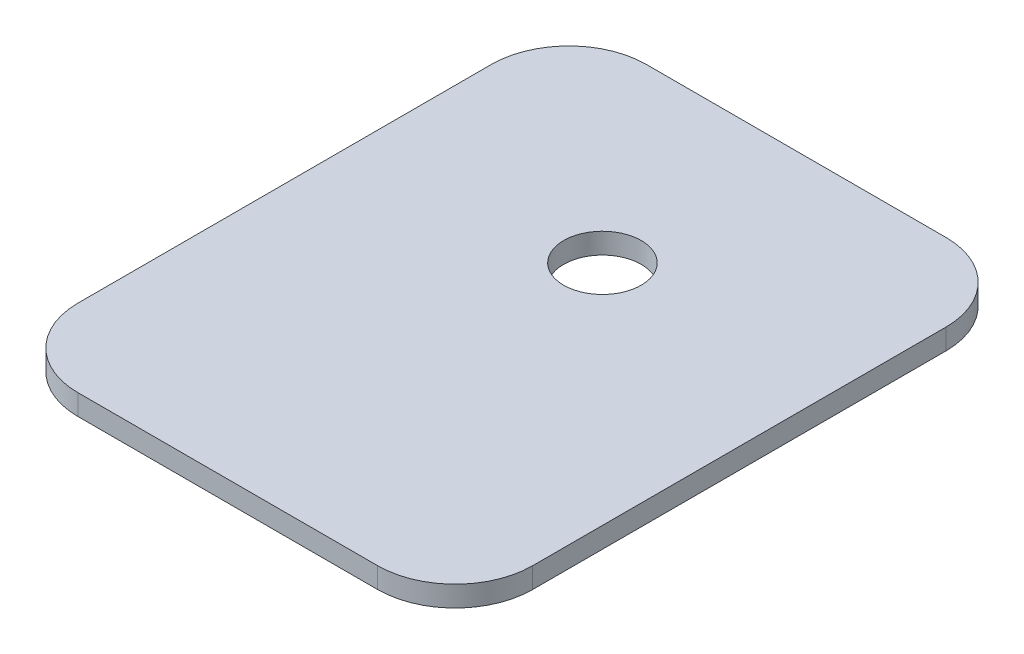
ISO-10303-21;
HEADER;
FILE_DESCRIPTION(('STEP AP214'),'2;1');
FILE_NAME('part.step','',(''),(''),'','','');
FILE_SCHEMA(('AUTOMOTIVE_DESIGN { 1 0 10303 214 1 1 1 1 }'));
ENDSEC;
DATA;
#1=APPLICATION_CONTEXT('core data for automotive mechanical design processes');
#2=APPLICATION_PROTOCOL_DEFINITION('international standard','automotive_design',2000,#1);
#3=PRODUCT_CONTEXT('',#1,'mechanical');
#4=PRODUCT('Part','Part','',(#3));
#5=PRODUCT_RELATED_PRODUCT_CATEGORY('part','',(#4));
#6=PRODUCT_DEFINITION_FORMATION('','',#4);
#7=PRODUCT_DEFINITION_CONTEXT('part definition',#1,'design');
#8=PRODUCT_DEFINITION('design','',#6,#7);
#9=PRODUCT_DEFINITION_SHAPE('','',#8);
#10=(LENGTH_UNIT() NAMED_UNIT(*) SI_UNIT(.MILLI.,.METRE.));
#11=(NAMED_UNIT(*) PLANE_ANGLE_UNIT() SI_UNIT($,.RADIAN.));
#12=(NAMED_UNIT(*) SI_UNIT($,.STERADIAN.) SOLID_ANGLE_UNIT());
#13=UNCERTAINTY_MEASURE_WITH_UNIT(LENGTH_MEASURE(1.E-05),#10,'distance_accuracy_value','');
#14=(GEOMETRIC_REPRESENTATION_CONTEXT(3) GLOBAL_UNCERTAINTY_ASSIGNED_CONTEXT((#13)) GLOBAL_UNIT_ASSIGNED_CONTEXT((#10,
#11,#12)) REPRESENTATION_CONTEXT('',''));
#15=CARTESIAN_POINT('',(0.,0.,0.));
#16=DIRECTION('',(0.,0.,1.));
#17=DIRECTION('',(1.,0.,0.));
#18=AXIS2_PLACEMENT_3D('',#15,#16,#17);
#19=CARTESIAN_POINT('',(17.6,1.6,22.));
#20=DIRECTION('',(-1.,0.,0.));
#21=DIRECTION('',(0.,0.,1.));
#22=AXIS2_PLACEMENT_3D('',#19,#20,#21);
#23=PLANE('',#22);
#24=DIRECTION('',(0.,0.,-1.));
#25=VECTOR('',#24,1.);
#26=CARTESIAN_POINT('',(17.6,0.,22.));
#27=LINE('',#26,#25);
#28=CARTESIAN_POINT('',(17.6,0.,16.));
#29=VERTEX_POINT('',#28);
#30=CARTESIAN_POINT('',(17.6,0.,-16.));
#31=VERTEX_POINT('',#30);
#32=EDGE_CURVE('E130',#29,#31,#27,.T.);
#33=ORIENTED_EDGE('',*,*,#32,.T.);
#34=DIRECTION('',(0.,-1.,0.));
#35=VECTOR('',#34,1.);
#36=CARTESIAN_POINT('',(17.6,1.6,-16.));
#37=LINE('',#36,#35);
#38=CARTESIAN_POINT('',(17.6,1.6,-16.));
#39=VERTEX_POINT('',#38);
#40=EDGE_CURVE('E152',#31,#39,#37,.F.);
#41=ORIENTED_EDGE('',*,*,#40,.T.);
#42=DIRECTION('',(0.,0.,-1.));
#43=VECTOR('',#42,1.);
#44=CARTESIAN_POINT('',(17.6,1.6,22.));
#45=LINE('',#44,#43);
#46=CARTESIAN_POINT('',(17.6,1.6,16.));
#47=VERTEX_POINT('',#46);
#48=EDGE_CURVE('E128',#47,#39,#45,.T.);
#49=ORIENTED_EDGE('',*,*,#48,.F.);
#50=DIRECTION('',(0.,-1.,0.));
#51=VECTOR('',#50,1.);
#52=CARTESIAN_POINT('',(17.6,1.6,16.));
#53=LINE('',#52,#51);
#54=EDGE_CURVE('E149',#47,#29,#53,.T.);
#55=ORIENTED_EDGE('',*,*,#54,.T.);
#56=EDGE_LOOP('',(#33,#41,#49,#55));
#57=FACE_BOUND('',#56,.T.);
#58=ADVANCED_FACE('F33',(#57),#23,.F.);
#59=CARTESIAN_POINT('',(-17.6,1.6,-22.));
#60=DIRECTION('',(0.,0.,1.));
#61=DIRECTION('',(1.,0.,0.));
#62=AXIS2_PLACEMENT_3D('',#59,#60,#61);
#63=PLANE('',#62);
#64=DIRECTION('',(-1.,0.,0.));
#65=VECTOR('',#64,1.);
#66=CARTESIAN_POINT('',(-17.6,0.,-22.));
#67=LINE('',#66,#65);
#68=CARTESIAN_POINT('',(11.6,0.,-22.));
#69=VERTEX_POINT('',#68);
#70=CARTESIAN_POINT('',(-11.6,0.,-22.));
#71=VERTEX_POINT('',#70);
#72=EDGE_CURVE('E126',#69,#71,#67,.T.);
#73=ORIENTED_EDGE('',*,*,#72,.T.);
#74=DIRECTION('',(0.,-1.,0.));
#75=VECTOR('',#74,1.);
#76=CARTESIAN_POINT('',(-11.6,1.6,-22.));
#77=LINE('',#76,#75);
#78=CARTESIAN_POINT('',(-11.6,1.6,-22.));
#79=VERTEX_POINT('',#78);
#80=EDGE_CURVE('E104',#71,#79,#77,.F.);
#81=ORIENTED_EDGE('',*,*,#80,.T.);
#82=DIRECTION('',(-1.,0.,0.));
#83=VECTOR('',#82,1.);
#84=CARTESIAN_POINT('',(-17.6,1.6,-22.));
#85=LINE('',#84,#83);
#86=CARTESIAN_POINT('',(11.6,1.6,-22.));
#87=VERTEX_POINT('',#86);
#88=EDGE_CURVE('E166',#87,#79,#85,.T.);
#89=ORIENTED_EDGE('',*,*,#88,.F.);
#90=DIRECTION('',(0.,-1.,0.));
#91=VECTOR('',#90,1.);
#92=CARTESIAN_POINT('',(11.6,1.6,-22.));
#93=LINE('',#92,#91);
#94=EDGE_CURVE('E109',#87,#69,#93,.T.);
#95=ORIENTED_EDGE('',*,*,#94,.T.);
#96=EDGE_LOOP('',(#73,#81,#89,#95));
#97=FACE_BOUND('',#96,.T.);
#98=ADVANCED_FACE('F171',(#97),#63,.F.);
#99=CARTESIAN_POINT('',(-17.6,1.6,22.));
#100=DIRECTION('',(1.,0.,0.));
#101=DIRECTION('',(0.,0.,-1.));
#102=AXIS2_PLACEMENT_3D('',#99,#100,#101);
#103=PLANE('',#102);
#104=DIRECTION('',(0.,0.,1.));
#105=VECTOR('',#104,1.);
#106=CARTESIAN_POINT('',(-17.6,1.6,22.));
#107=LINE('',#106,#105);
#108=CARTESIAN_POINT('',(-17.6,1.6,-16.));
#109=VERTEX_POINT('',#108);
#110=CARTESIAN_POINT('',(-17.6,1.6,16.));
#111=VERTEX_POINT('',#110);
#112=EDGE_CURVE('E118',#109,#111,#107,.T.);
#113=ORIENTED_EDGE('',*,*,#112,.F.);
#114=DIRECTION('',(0.,-1.,0.));
#115=VECTOR('',#114,1.);
#116=CARTESIAN_POINT('',(-17.6,1.6,-16.));
#117=LINE('',#116,#115);
#118=CARTESIAN_POINT('',(-17.6,0.,-16.));
#119=VERTEX_POINT('',#118);
#120=EDGE_CURVE('E103',#109,#119,#117,.T.);
#121=ORIENTED_EDGE('',*,*,#120,.T.);
#122=DIRECTION('',(0.,0.,1.));
#123=VECTOR('',#122,1.);
#124=CARTESIAN_POINT('',(-17.6,0.,22.));
#125=LINE('',#124,#123);
#126=CARTESIAN_POINT('',(-17.6,0.,16.));
#127=VERTEX_POINT('',#126);
#128=EDGE_CURVE('E116',#119,#127,#125,.T.);
#129=ORIENTED_EDGE('',*,*,#128,.T.);
#130=DIRECTION('',(0.,-1.,0.));
#131=VECTOR('',#130,1.);
#132=CARTESIAN_POINT('',(-17.6,1.6,16.));
#133=LINE('',#132,#131);
#134=EDGE_CURVE('E120',#127,#111,#133,.F.);
#135=ORIENTED_EDGE('',*,*,#134,.T.);
#136=EDGE_LOOP('',(#113,#121,#129,#135));
#137=FACE_BOUND('',#136,.T.);
#138=ADVANCED_FACE('F115',(#137),#103,.F.);
#139=CARTESIAN_POINT('',(-17.6,1.6,22.));
#140=DIRECTION('',(0.,0.,-1.));
#141=DIRECTION('',(-1.,0.,0.));
#142=AXIS2_PLACEMENT_3D('',#139,#140,#141);
#143=PLANE('',#142);
#144=DIRECTION('',(1.,0.,0.));
#145=VECTOR('',#144,1.);
#146=CARTESIAN_POINT('',(-17.6,1.6,22.));
#147=LINE('',#146,#145);
#148=CARTESIAN_POINT('',(-11.6,1.6,22.));
#149=VERTEX_POINT('',#148);
#150=CARTESIAN_POINT('',(11.6,1.6,22.));
#151=VERTEX_POINT('',#150);
#152=EDGE_CURVE('E134',#149,#151,#147,.T.);
#153=ORIENTED_EDGE('',*,*,#152,.F.);
#154=DIRECTION('',(0.,-1.,0.));
#155=VECTOR('',#154,1.);
#156=CARTESIAN_POINT('',(-11.6,1.6,22.));
#157=LINE('',#156,#155);
#158=CARTESIAN_POINT('',(-11.6,0.,22.));
#159=VERTEX_POINT('',#158);
#160=EDGE_CURVE('E11',#149,#159,#157,.T.);
#161=ORIENTED_EDGE('',*,*,#160,.T.);
#162=DIRECTION('',(1.,0.,0.));
#163=VECTOR('',#162,1.);
#164=CARTESIAN_POINT('',(-17.6,0.,22.));
#165=LINE('',#164,#163);
#166=CARTESIAN_POINT('',(11.6,0.,22.));
#167=VERTEX_POINT('',#166);
#168=EDGE_CURVE('E125',#159,#167,#165,.T.);
#169=ORIENTED_EDGE('',*,*,#168,.T.);
#170=DIRECTION('',(0.,-1.,0.));
#171=VECTOR('',#170,1.);
#172=CARTESIAN_POINT('',(11.6,1.6,22.));
#173=LINE('',#172,#171);
#174=EDGE_CURVE('E41',#167,#151,#173,.F.);
#175=ORIENTED_EDGE('',*,*,#174,.T.);
#176=EDGE_LOOP('',(#153,#161,#169,#175));
#177=FACE_BOUND('',#176,.T.);
#178=ADVANCED_FACE('F187',(#177),#143,.F.);
#179=CARTESIAN_POINT('',(0.,1.6,0.));
#180=DIRECTION('',(0.,-1.,0.));
#181=DIRECTION('',(0.,0.,-1.));
#182=AXIS2_PLACEMENT_3D('',#179,#180,#181);
#183=PLANE('',#182);
#184=CARTESIAN_POINT('',(0.,1.6,-6.99999999999999));
#185=DIRECTION('',(0.,1.,0.));
#186=DIRECTION('',(0.,0.,1.));
#187=AXIS2_PLACEMENT_3D('',#184,#185,#186);
#188=CIRCLE('',#187,3.);
#189=CARTESIAN_POINT('',(0.,1.6,-3.99999999999999));
#190=VERTEX_POINT('',#189);
#191=EDGE_CURVE('E174',#190,#190,#188,.T.);
#192=ORIENTED_EDGE('',*,*,#191,.F.);
#193=EDGE_LOOP('',(#192));
#194=FACE_BOUND('',#193,.T.);
#195=ORIENTED_EDGE('',*,*,#88,.T.);
#196=CARTESIAN_POINT('',(-11.6,1.6,-16.));
#197=DIRECTION('',(0.,-1.,0.));
#198=DIRECTION('',(0.,0.,-1.));
#199=AXIS2_PLACEMENT_3D('',#196,#197,#198);
#200=CIRCLE('',#199,6.);
#201=EDGE_CURVE('E147',#79,#109,#200,.F.);
#202=ORIENTED_EDGE('',*,*,#201,.T.);
#203=ORIENTED_EDGE('',*,*,#112,.T.);
#204=CARTESIAN_POINT('',(-11.6,1.6,16.));
#205=DIRECTION('',(0.,-1.,0.));
#206=DIRECTION('',(0.,0.,-1.));
#207=AXIS2_PLACEMENT_3D('',#204,#205,#206);
#208=CIRCLE('',#207,6.);
#209=EDGE_CURVE('E54',#111,#149,#208,.F.);
#210=ORIENTED_EDGE('',*,*,#209,.T.);
#211=ORIENTED_EDGE('',*,*,#152,.T.);
#212=CARTESIAN_POINT('',(11.6,1.6,16.));
#213=DIRECTION('',(0.,-1.,0.));
#214=DIRECTION('',(0.,0.,-1.));
#215=AXIS2_PLACEMENT_3D('',#212,#213,#214);
#216=CIRCLE('',#215,6.);
#217=EDGE_CURVE('E142',#151,#47,#216,.F.);
#218=ORIENTED_EDGE('',*,*,#217,.T.);
#219=ORIENTED_EDGE('',*,*,#48,.T.);
#220=CARTESIAN_POINT('',(11.6,1.6,-16.));
#221=DIRECTION('',(0.,-1.,0.));
#222=DIRECTION('',(0.,0.,-1.));
#223=AXIS2_PLACEMENT_3D('',#220,#221,#222);
#224=CIRCLE('',#223,6.);
#225=EDGE_CURVE('E145',#39,#87,#224,.F.);
#226=ORIENTED_EDGE('',*,*,#225,.T.);
#227=EDGE_LOOP('',(#195,#202,#203,#210,#211,#218,#219,#226));
#228=FACE_BOUND('',#227,.T.);
#229=ADVANCED_FACE('F163',(#194,#228),#183,.F.);
#230=CARTESIAN_POINT('',(0.,0.,0.));
#231=DIRECTION('',(0.,-1.,0.));
#232=DIRECTION('',(0.,0.,-1.));
#233=AXIS2_PLACEMENT_3D('',#230,#231,#232);
#234=PLANE('',#233);
#235=CARTESIAN_POINT('',(0.,0.,-6.99999999999999));
#236=DIRECTION('',(0.,-1.,0.));
#237=DIRECTION('',(0.,0.,-1.));
#238=AXIS2_PLACEMENT_3D('',#235,#236,#237);
#239=CIRCLE('',#238,3.);
#240=CARTESIAN_POINT('',(0.,0.,-9.99999999999999));
#241=VERTEX_POINT('',#240);
#242=EDGE_CURVE('E172',#241,#241,#239,.F.);
#243=ORIENTED_EDGE('',*,*,#242,.T.);
#244=EDGE_LOOP('',(#243));
#245=FACE_BOUND('',#244,.T.);
#246=ORIENTED_EDGE('',*,*,#128,.F.);
#247=CARTESIAN_POINT('',(-11.6,0.,-16.));
#248=DIRECTION('',(0.,-1.,0.));
#249=DIRECTION('',(0.,0.,-1.));
#250=AXIS2_PLACEMENT_3D('',#247,#248,#249);
#251=CIRCLE('',#250,6.);
#252=EDGE_CURVE('E99',#119,#71,#251,.T.);
#253=ORIENTED_EDGE('',*,*,#252,.T.);
#254=ORIENTED_EDGE('',*,*,#72,.F.);
#255=CARTESIAN_POINT('',(11.6,0.,-16.));
#256=DIRECTION('',(0.,-1.,0.));
#257=DIRECTION('',(0.,0.,-1.));
#258=AXIS2_PLACEMENT_3D('',#255,#256,#257);
#259=CIRCLE('',#258,6.);
#260=EDGE_CURVE('E110',#69,#31,#259,.T.);
#261=ORIENTED_EDGE('',*,*,#260,.T.);
#262=ORIENTED_EDGE('',*,*,#32,.F.);
#263=CARTESIAN_POINT('',(11.6,0.,16.));
#264=DIRECTION('',(0.,-1.,0.));
#265=DIRECTION('',(0.,0.,-1.));
#266=AXIS2_PLACEMENT_3D('',#263,#264,#265);
#267=CIRCLE('',#266,6.);
#268=EDGE_CURVE('E119',#29,#167,#267,.T.);
#269=ORIENTED_EDGE('',*,*,#268,.T.);
#270=ORIENTED_EDGE('',*,*,#168,.F.);
#271=CARTESIAN_POINT('',(-11.6,0.,16.));
#272=DIRECTION('',(0.,-1.,0.));
#273=DIRECTION('',(0.,0.,-1.));
#274=AXIS2_PLACEMENT_3D('',#271,#272,#273);
#275=CIRCLE('',#274,6.);
#276=EDGE_CURVE('E124',#159,#127,#275,.T.);
#277=ORIENTED_EDGE('',*,*,#276,.T.);
#278=EDGE_LOOP('',(#246,#253,#254,#261,#262,#269,#270,#277));
#279=FACE_BOUND('',#278,.T.);
#280=ADVANCED_FACE('F122',(#245,#279),#234,.T.);
#281=CARTESIAN_POINT('',(-11.6,1.6,-16.));
#282=DIRECTION('',(0.,-1.,0.));
#283=DIRECTION('',(0.,0.,-1.));
#284=AXIS2_PLACEMENT_3D('',#281,#282,#283);
#285=CYLINDRICAL_SURFACE('',#284,6.);
#286=ORIENTED_EDGE('',*,*,#201,.F.);
#287=ORIENTED_EDGE('',*,*,#80,.F.);
#288=ORIENTED_EDGE('',*,*,#252,.F.);
#289=ORIENTED_EDGE('',*,*,#120,.F.);
#290=EDGE_LOOP('',(#286,#287,#288,#289));
#291=FACE_BOUND('',#290,.T.);
#292=ADVANCED_FACE('F102',(#291),#285,.T.);
#293=CARTESIAN_POINT('',(11.6,1.6,-16.));
#294=DIRECTION('',(0.,-1.,0.));
#295=DIRECTION('',(0.,0.,-1.));
#296=AXIS2_PLACEMENT_3D('',#293,#294,#295);
#297=CYLINDRICAL_SURFACE('',#296,6.);
#298=ORIENTED_EDGE('',*,*,#225,.F.);
#299=ORIENTED_EDGE('',*,*,#40,.F.);
#300=ORIENTED_EDGE('',*,*,#260,.F.);
#301=ORIENTED_EDGE('',*,*,#94,.F.);
#302=EDGE_LOOP('',(#298,#299,#300,#301));
#303=FACE_BOUND('',#302,.T.);
#304=ADVANCED_FACE('F169',(#303),#297,.T.);
#305=CARTESIAN_POINT('',(-11.6,1.6,16.));
#306=DIRECTION('',(0.,-1.,0.));
#307=DIRECTION('',(0.,0.,-1.));
#308=AXIS2_PLACEMENT_3D('',#305,#306,#307);
#309=CYLINDRICAL_SURFACE('',#308,6.);
#310=ORIENTED_EDGE('',*,*,#209,.F.);
#311=ORIENTED_EDGE('',*,*,#134,.F.);
#312=ORIENTED_EDGE('',*,*,#276,.F.);
#313=ORIENTED_EDGE('',*,*,#160,.F.);
#314=EDGE_LOOP('',(#310,#311,#312,#313));
#315=FACE_BOUND('',#314,.T.);
#316=ADVANCED_FACE('F208',(#315),#309,.T.);
#317=CARTESIAN_POINT('',(11.6,1.6,16.));
#318=DIRECTION('',(0.,-1.,0.));
#319=DIRECTION('',(0.,0.,-1.));
#320=AXIS2_PLACEMENT_3D('',#317,#318,#319);
#321=CYLINDRICAL_SURFACE('',#320,6.);
#322=ORIENTED_EDGE('',*,*,#217,.F.);
#323=ORIENTED_EDGE('',*,*,#174,.F.);
#324=ORIENTED_EDGE('',*,*,#268,.F.);
#325=ORIENTED_EDGE('',*,*,#54,.F.);
#326=EDGE_LOOP('',(#322,#323,#324,#325));
#327=FACE_BOUND('',#326,.T.);
#328=ADVANCED_FACE('F35',(#327),#321,.T.);
#329=CARTESIAN_POINT('',(0.,-8.48528137423857,-6.99999999999999));
#330=DIRECTION('',(0.,1.,0.));
#331=DIRECTION('',(0.,0.,1.));
#332=AXIS2_PLACEMENT_3D('',#329,#330,#331);
#333=CYLINDRICAL_SURFACE('',#332,3.);
#334=ORIENTED_EDGE('',*,*,#191,.T.);
#335=EDGE_LOOP('',(#334));
#336=FACE_BOUND('',#335,.T.);
#337=ORIENTED_EDGE('',*,*,#242,.F.);
#338=EDGE_LOOP('',(#337));
#339=FACE_BOUND('',#338,.T.);
#340=ADVANCED_FACE('F183',(#336,#339),#333,.F.);
#341=CLOSED_SHELL('',(#58,#98,#138,#178,#229,#280,#292,#304,#316,#328,#340));
#342=MANIFOLD_SOLID_BREP('B2',#341);
#343=ADVANCED_BREP_SHAPE_REPRESENTATION('',(#18,#342),#14);
#344=SHAPE_DEFINITION_REPRESENTATION(#9,#343);
ENDSEC;
END-ISO-10303-21;
